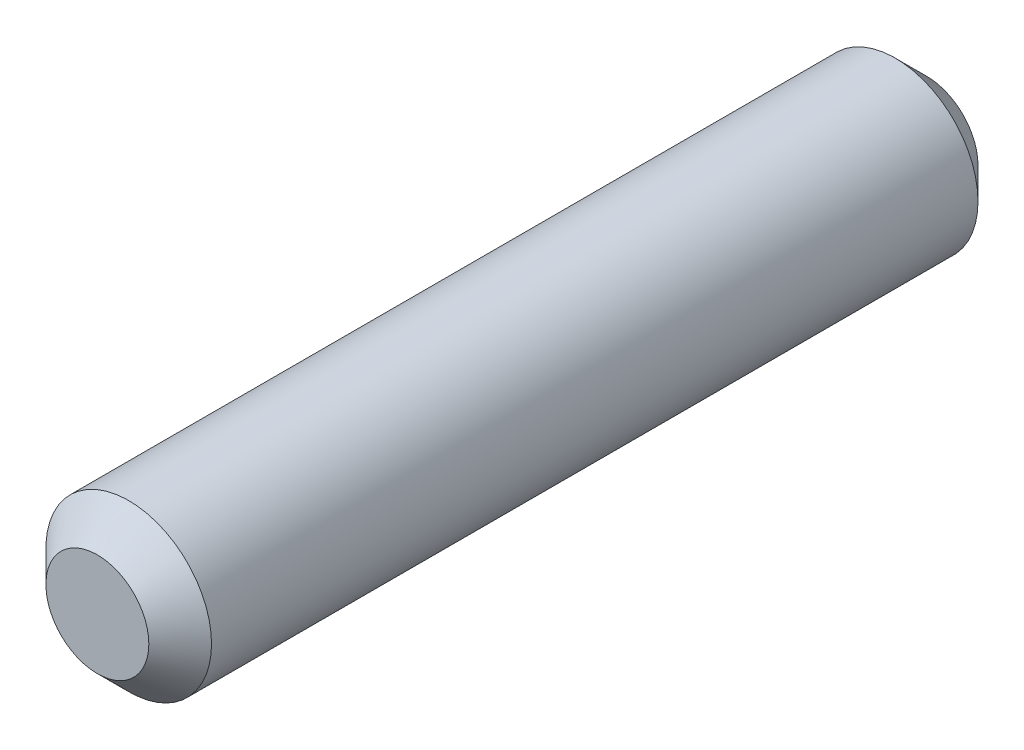
ISO-10303-21;
HEADER;
FILE_DESCRIPTION(('STEP AP214'),'2;1');
FILE_NAME('part.step','',(''),(''),'','','');
FILE_SCHEMA(('AUTOMOTIVE_DESIGN { 1 0 10303 214 1 1 1 1 }'));
ENDSEC;
DATA;
#1=APPLICATION_CONTEXT('core data for automotive mechanical design processes');
#2=APPLICATION_PROTOCOL_DEFINITION('international standard','automotive_design',2000,#1);
#3=PRODUCT_CONTEXT('',#1,'mechanical');
#4=PRODUCT('Part','Part','',(#3));
#5=PRODUCT_RELATED_PRODUCT_CATEGORY('part','',(#4));
#6=PRODUCT_DEFINITION_FORMATION('','',#4);
#7=PRODUCT_DEFINITION_CONTEXT('part definition',#1,'design');
#8=PRODUCT_DEFINITION('design','',#6,#7);
#9=PRODUCT_DEFINITION_SHAPE('','',#8);
#10=(LENGTH_UNIT() NAMED_UNIT(*) SI_UNIT(.MILLI.,.METRE.));
#11=(NAMED_UNIT(*) PLANE_ANGLE_UNIT() SI_UNIT($,.RADIAN.));
#12=(NAMED_UNIT(*) SI_UNIT($,.STERADIAN.) SOLID_ANGLE_UNIT());
#13=UNCERTAINTY_MEASURE_WITH_UNIT(LENGTH_MEASURE(1.E-05),#10,'distance_accuracy_value','');
#14=(GEOMETRIC_REPRESENTATION_CONTEXT(3) GLOBAL_UNCERTAINTY_ASSIGNED_CONTEXT((#13)) GLOBAL_UNIT_ASSIGNED_CONTEXT((#10,
#11,#12)) REPRESENTATION_CONTEXT('',''));
#15=CARTESIAN_POINT('',(0.,0.,0.));
#16=DIRECTION('',(0.,0.,1.));
#17=DIRECTION('',(1.,0.,0.));
#18=AXIS2_PLACEMENT_3D('',#15,#16,#17);
#19=CARTESIAN_POINT('',(0.,0.,7.935));
#20=DIRECTION('',(0.,0.,-1.));
#21=DIRECTION('',(-1.,0.,0.));
#22=AXIS2_PLACEMENT_3D('',#19,#20,#21);
#23=CYLINDRICAL_SURFACE('',#22,1.585);
#24=CARTESIAN_POINT('',(0.,0.,-7.335));
#25=DIRECTION('',(0.,0.,1.));
#26=DIRECTION('',(1.,0.,0.));
#27=AXIS2_PLACEMENT_3D('',#24,#25,#26);
#28=CIRCLE('',#27,1.585);
#29=CARTESIAN_POINT('',(1.585,0.,-7.335));
#30=VERTEX_POINT('',#29);
#31=EDGE_CURVE('E55',#30,#30,#28,.T.);
#32=ORIENTED_EDGE('',*,*,#31,.T.);
#33=EDGE_LOOP('',(#32));
#34=FACE_BOUND('',#33,.T.);
#35=CARTESIAN_POINT('',(0.,0.,7.335));
#36=DIRECTION('',(0.,0.,1.));
#37=DIRECTION('',(1.,0.,0.));
#38=AXIS2_PLACEMENT_3D('',#35,#36,#37);
#39=CIRCLE('',#38,1.585);
#40=CARTESIAN_POINT('',(1.585,0.,7.335));
#41=VERTEX_POINT('',#40);
#42=EDGE_CURVE('E59',#41,#41,#39,.F.);
#43=ORIENTED_EDGE('',*,*,#42,.T.);
#44=EDGE_LOOP('',(#43));
#45=FACE_BOUND('',#44,.T.);
#46=ADVANCED_FACE('F43',(#34,#45),#23,.T.);
#47=CARTESIAN_POINT('',(0.,0.,7.935));
#48=DIRECTION('',(0.,0.,1.));
#49=DIRECTION('',(1.,0.,0.));
#50=AXIS2_PLACEMENT_3D('',#47,#48,#49);
#51=PLANE('',#50);
#52=CARTESIAN_POINT('',(0.,0.,7.935));
#53=DIRECTION('',(0.,0.,1.));
#54=DIRECTION('',(1.,0.,0.));
#55=AXIS2_PLACEMENT_3D('',#52,#53,#54);
#56=CIRCLE('',#55,0.984999999999998);
#57=CARTESIAN_POINT('',(0.984999999999998,0.,7.935));
#58=VERTEX_POINT('',#57);
#59=EDGE_CURVE('E10',#58,#58,#56,.T.);
#60=ORIENTED_EDGE('',*,*,#59,.T.);
#61=EDGE_LOOP('',(#60));
#62=FACE_BOUND('',#61,.T.);
#63=ADVANCED_FACE('F75',(#62),#51,.T.);
#64=CARTESIAN_POINT('',(0.,0.,-7.935));
#65=DIRECTION('',(0.,0.,1.));
#66=DIRECTION('',(1.,0.,0.));
#67=AXIS2_PLACEMENT_3D('',#64,#65,#66);
#68=PLANE('',#67);
#69=CARTESIAN_POINT('',(0.,0.,-7.935));
#70=DIRECTION('',(0.,0.,1.));
#71=DIRECTION('',(1.,0.,0.));
#72=AXIS2_PLACEMENT_3D('',#69,#70,#71);
#73=CIRCLE('',#72,0.984999999999998);
#74=CARTESIAN_POINT('',(0.984999999999997,0.,-7.935));
#75=VERTEX_POINT('',#74);
#76=EDGE_CURVE('E51',#75,#75,#73,.F.);
#77=ORIENTED_EDGE('',*,*,#76,.T.);
#78=EDGE_LOOP('',(#77));
#79=FACE_BOUND('',#78,.T.);
#80=ADVANCED_FACE('F72',(#79),#68,.F.);
#81=CARTESIAN_POINT('',(0.,0.,-7.335));
#82=DIRECTION('',(0.,0.,1.));
#83=DIRECTION('',(1.,0.,0.));
#84=AXIS2_PLACEMENT_3D('',#81,#82,#83);
#85=CONICAL_SURFACE('',#84,1.585,0.785398163397449);
#86=CARTESIAN_POINT('',(0.984999999999997,0.,-7.935));
#87=CARTESIAN_POINT('',(0.991249999999997,0.,-7.92875));
#88=CARTESIAN_POINT('',(0.997499999999997,0.,-7.9225));
#89=CARTESIAN_POINT('',(1.01,0.,-7.91));
#90=CARTESIAN_POINT('',(1.01625,0.,-7.90375));
#91=CARTESIAN_POINT('',(1.02875,0.,-7.89125));
#92=CARTESIAN_POINT('',(1.035,0.,-7.885));
#93=CARTESIAN_POINT('',(1.0475,0.,-7.8725));
#94=CARTESIAN_POINT('',(1.05375,0.,-7.86625));
#95=CARTESIAN_POINT('',(1.06625,0.,-7.85375));
#96=CARTESIAN_POINT('',(1.0725,0.,-7.8475));
#97=CARTESIAN_POINT('',(1.085,0.,-7.835));
#98=CARTESIAN_POINT('',(1.09125,0.,-7.82875));
#99=CARTESIAN_POINT('',(1.10375,0.,-7.81625));
#100=CARTESIAN_POINT('',(1.11,0.,-7.81));
#101=CARTESIAN_POINT('',(1.1225,0.,-7.7975));
#102=CARTESIAN_POINT('',(1.12875,0.,-7.79125));
#103=CARTESIAN_POINT('',(1.14125,0.,-7.77875));
#104=CARTESIAN_POINT('',(1.1475,0.,-7.7725));
#105=CARTESIAN_POINT('',(1.16,0.,-7.76));
#106=CARTESIAN_POINT('',(1.16625,0.,-7.75375));
#107=CARTESIAN_POINT('',(1.17875,0.,-7.74125));
#108=CARTESIAN_POINT('',(1.185,0.,-7.735));
#109=CARTESIAN_POINT('',(1.1975,0.,-7.7225));
#110=CARTESIAN_POINT('',(1.20375,0.,-7.71625));
#111=CARTESIAN_POINT('',(1.21625,0.,-7.70375));
#112=CARTESIAN_POINT('',(1.2225,0.,-7.6975));
#113=CARTESIAN_POINT('',(1.235,0.,-7.685));
#114=CARTESIAN_POINT('',(1.24125,0.,-7.67875));
#115=CARTESIAN_POINT('',(1.25375,0.,-7.66625));
#116=CARTESIAN_POINT('',(1.26,0.,-7.66));
#117=CARTESIAN_POINT('',(1.2725,0.,-7.6475));
#118=CARTESIAN_POINT('',(1.27875,0.,-7.64125));
#119=CARTESIAN_POINT('',(1.29125,0.,-7.62875));
#120=CARTESIAN_POINT('',(1.2975,0.,-7.6225));
#121=CARTESIAN_POINT('',(1.31,0.,-7.61));
#122=CARTESIAN_POINT('',(1.31625,0.,-7.60375));
#123=CARTESIAN_POINT('',(1.32875,0.,-7.59125));
#124=CARTESIAN_POINT('',(1.335,0.,-7.585));
#125=CARTESIAN_POINT('',(1.3475,0.,-7.5725));
#126=CARTESIAN_POINT('',(1.35375,0.,-7.56625));
#127=CARTESIAN_POINT('',(1.36625,0.,-7.55375));
#128=CARTESIAN_POINT('',(1.3725,0.,-7.5475));
#129=CARTESIAN_POINT('',(1.385,0.,-7.535));
#130=CARTESIAN_POINT('',(1.39125,0.,-7.52875));
#131=CARTESIAN_POINT('',(1.40375,0.,-7.51625));
#132=CARTESIAN_POINT('',(1.41,0.,-7.51));
#133=CARTESIAN_POINT('',(1.4225,0.,-7.4975));
#134=CARTESIAN_POINT('',(1.42875,0.,-7.49125));
#135=CARTESIAN_POINT('',(1.44125,0.,-7.47875));
#136=CARTESIAN_POINT('',(1.4475,0.,-7.4725));
#137=CARTESIAN_POINT('',(1.46,0.,-7.46));
#138=CARTESIAN_POINT('',(1.46625,0.,-7.45375));
#139=CARTESIAN_POINT('',(1.47875,0.,-7.44125));
#140=CARTESIAN_POINT('',(1.485,0.,-7.435));
#141=CARTESIAN_POINT('',(1.4975,0.,-7.4225));
#142=CARTESIAN_POINT('',(1.50375,0.,-7.41625));
#143=CARTESIAN_POINT('',(1.51625,0.,-7.40375));
#144=CARTESIAN_POINT('',(1.5225,0.,-7.3975));
#145=CARTESIAN_POINT('',(1.535,0.,-7.385));
#146=CARTESIAN_POINT('',(1.54125,0.,-7.37875));
#147=CARTESIAN_POINT('',(1.55375,0.,-7.36625));
#148=CARTESIAN_POINT('',(1.56,0.,-7.36));
#149=CARTESIAN_POINT('',(1.5725,0.,-7.3475));
#150=CARTESIAN_POINT('',(1.57875,0.,-7.34125));
#151=CARTESIAN_POINT('',(1.585,0.,-7.335));
#152=B_SPLINE_CURVE_WITH_KNOTS('',3,(#86,#87,#88,#89,#90,#91,#92,#93,#94,#95,#96,#97,#98,#99,
#100,#101,#102,#103,#104,#105,#106,#107,#108,#109,#110,#111,#112,#113,#114,#115,#116,#117,#118,
#119,#120,#121,#122,#123,#124,#125,#126,#127,#128,#129,#130,#131,#132,#133,#134,#135,#136,#137,
#138,#139,#140,#141,#142,#143,#144,#145,#146,#147,#148,#149,#150,#151),.UNSPECIFIED.,.F.,.F.,(4,
2,2,2,2,2,2,2,2,2,2,2,2,2,2,2,2,2,2,2,2,2,2,2,2,2,2,2,2,2,2,2,4),(0.,0.0265165042944954,
0.0530330085889906,0.0795495128834861,0.106066017177981,0.132582521472478,0.159099025766973,
0.185615530061469,0.212132034355965,0.23864853865046,0.265165042944956,0.291681547239451,
0.318198051533947,0.344714555828443,0.371231060122938,0.397747564417434,0.424264068711929,
0.450780573006425,0.477297077300921,0.503813581595417,0.530330085889912,0.556846590184408,
0.583363094478903,0.609879598773399,0.636396103067895,0.66291260736239,0.689429111656886,
0.715945615951381,0.742462120245877,0.768978624540373,0.795495128834869,0.822011633129364,
0.84852813742386),.UNSPECIFIED.);
#153=EDGE_CURVE('BSEAM68',#75,#30,#152,.T.);
#154=ORIENTED_EDGE('',*,*,#76,.F.);
#155=ORIENTED_EDGE('',*,*,#31,.F.);
#156=ORIENTED_EDGE('',*,*,#153,.T.);
#157=ORIENTED_EDGE('',*,*,#153,.F.);
#158=EDGE_LOOP('',(#154,#156,#155,#157));
#159=FACE_BOUND('',#158,.T.);
#160=ADVANCED_FACE('F68',(#159),#85,.T.);
#161=CARTESIAN_POINT('',(0.,0.,7.935));
#162=DIRECTION('',(0.,0.,-1.));
#163=DIRECTION('',(-1.,0.,0.));
#164=AXIS2_PLACEMENT_3D('',#161,#162,#163);
#165=CONICAL_SURFACE('',#164,0.984999999999998,0.785398163397448);
#166=ORIENTED_EDGE('',*,*,#42,.F.);
#167=EDGE_LOOP('',(#166));
#168=FACE_BOUND('',#167,.T.);
#169=ORIENTED_EDGE('',*,*,#59,.F.);
#170=EDGE_LOOP('',(#169));
#171=FACE_BOUND('',#170,.T.);
#172=ADVANCED_FACE('F46',(#168,#171),#165,.T.);
#173=CLOSED_SHELL('',(#46,#63,#80,#160,#172));
#174=MANIFOLD_SOLID_BREP('B2',#173);
#175=ADVANCED_BREP_SHAPE_REPRESENTATION('',(#18,#174),#14);
#176=SHAPE_DEFINITION_REPRESENTATION(#9,#175);
ENDSEC;
END-ISO-10303-21;
